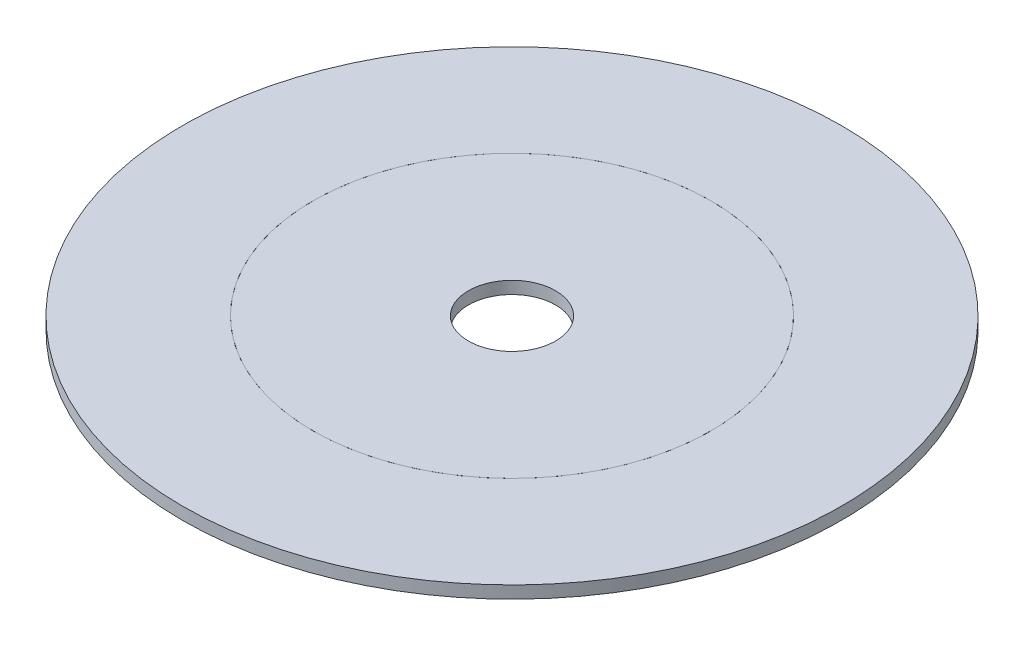
ISO-10303-21;
HEADER;
FILE_DESCRIPTION(('STEP AP214'),'2;1');
FILE_NAME('part.step','',(''),(''),'','','');
FILE_SCHEMA(('AUTOMOTIVE_DESIGN { 1 0 10303 214 1 1 1 1 }'));
ENDSEC;
DATA;
#1=APPLICATION_CONTEXT('core data for automotive mechanical design processes');
#2=APPLICATION_PROTOCOL_DEFINITION('international standard','automotive_design',2000,#1);
#3=PRODUCT_CONTEXT('',#1,'mechanical');
#4=PRODUCT('Part','Part','',(#3));
#5=PRODUCT_RELATED_PRODUCT_CATEGORY('part','',(#4));
#6=PRODUCT_DEFINITION_FORMATION('','',#4);
#7=PRODUCT_DEFINITION_CONTEXT('part definition',#1,'design');
#8=PRODUCT_DEFINITION('design','',#6,#7);
#9=PRODUCT_DEFINITION_SHAPE('','',#8);
#10=(LENGTH_UNIT() NAMED_UNIT(*) SI_UNIT(.MILLI.,.METRE.));
#11=(NAMED_UNIT(*) PLANE_ANGLE_UNIT() SI_UNIT($,.RADIAN.));
#12=(NAMED_UNIT(*) SI_UNIT($,.STERADIAN.) SOLID_ANGLE_UNIT());
#13=UNCERTAINTY_MEASURE_WITH_UNIT(LENGTH_MEASURE(1.E-05),#10,'distance_accuracy_value','');
#14=(GEOMETRIC_REPRESENTATION_CONTEXT(3) GLOBAL_UNCERTAINTY_ASSIGNED_CONTEXT((#13)) GLOBAL_UNIT_ASSIGNED_CONTEXT((#10,
#11,#12)) REPRESENTATION_CONTEXT('',''));
#15=CARTESIAN_POINT('',(0.,0.,0.));
#16=DIRECTION('',(0.,0.,1.));
#17=DIRECTION('',(1.,0.,0.));
#18=AXIS2_PLACEMENT_3D('',#15,#16,#17);
#19=CARTESIAN_POINT('',(0.,0.9,0.));
#20=DIRECTION('',(0.,-1.,0.));
#21=DIRECTION('',(0.,0.,-1.));
#22=AXIS2_PLACEMENT_3D('',#19,#20,#21);
#23=CYLINDRICAL_SURFACE('',#22,14.5);
#24=CARTESIAN_POINT('',(0.,0.9,0.));
#25=DIRECTION('',(0.,-1.,0.));
#26=DIRECTION('',(0.,0.,-1.));
#27=AXIS2_PLACEMENT_3D('',#24,#25,#26);
#28=CIRCLE('',#27,14.5);
#29=CARTESIAN_POINT('',(0.,0.9,-14.5));
#30=VERTEX_POINT('',#29);
#31=EDGE_CURVE('E11',#30,#30,#28,.T.);
#32=ORIENTED_EDGE('',*,*,#31,.T.);
#33=EDGE_LOOP('',(#32));
#34=FACE_BOUND('',#33,.T.);
#35=CARTESIAN_POINT('',(0.,0.,0.));
#36=DIRECTION('',(0.,-1.,0.));
#37=DIRECTION('',(0.,0.,-1.));
#38=AXIS2_PLACEMENT_3D('',#35,#36,#37);
#39=CIRCLE('',#38,14.5);
#40=CARTESIAN_POINT('',(0.,0.,-14.5));
#41=VERTEX_POINT('',#40);
#42=EDGE_CURVE('E43',#41,#41,#39,.T.);
#43=ORIENTED_EDGE('',*,*,#42,.F.);
#44=EDGE_LOOP('',(#43));
#45=FACE_BOUND('',#44,.T.);
#46=ADVANCED_FACE('F40',(#34,#45),#23,.T.);
#47=CARTESIAN_POINT('',(0.,0.9,0.));
#48=DIRECTION('',(0.,-1.,0.));
#49=DIRECTION('',(0.,0.,-1.));
#50=AXIS2_PLACEMENT_3D('',#47,#48,#49);
#51=PLANE('',#50);
#52=CARTESIAN_POINT('',(0.,0.9,0.));
#53=DIRECTION('',(0.,-1.,0.));
#54=DIRECTION('',(0.,0.,-1.));
#55=AXIS2_PLACEMENT_3D('',#52,#53,#54);
#56=CIRCLE('',#55,3.175);
#57=CARTESIAN_POINT('',(0.,0.9,-3.175));
#58=VERTEX_POINT('',#57);
#59=EDGE_CURVE('E50',#58,#58,#56,.T.);
#60=ORIENTED_EDGE('',*,*,#59,.T.);
#61=EDGE_LOOP('',(#60));
#62=FACE_BOUND('',#61,.T.);
#63=ORIENTED_EDGE('',*,*,#31,.F.);
#64=EDGE_LOOP('',(#63));
#65=FACE_BOUND('',#64,.T.);
#66=ADVANCED_FACE('F58',(#62,#65),#51,.F.);
#67=CARTESIAN_POINT('',(0.,0.,0.));
#68=DIRECTION('',(0.,-1.,0.));
#69=DIRECTION('',(0.,0.,-1.));
#70=AXIS2_PLACEMENT_3D('',#67,#68,#69);
#71=PLANE('',#70);
#72=CARTESIAN_POINT('',(0.,0.,0.));
#73=DIRECTION('',(0.,-1.,0.));
#74=DIRECTION('',(0.,0.,-1.));
#75=AXIS2_PLACEMENT_3D('',#72,#73,#74);
#76=CIRCLE('',#75,3.175);
#77=CARTESIAN_POINT('',(0.,0.,-3.175));
#78=VERTEX_POINT('',#77);
#79=EDGE_CURVE('E52',#78,#78,#76,.T.);
#80=ORIENTED_EDGE('',*,*,#79,.F.);
#81=EDGE_LOOP('',(#80));
#82=FACE_BOUND('',#81,.T.);
#83=ORIENTED_EDGE('',*,*,#42,.T.);
#84=EDGE_LOOP('',(#83));
#85=FACE_BOUND('',#84,.T.);
#86=ADVANCED_FACE('F64',(#82,#85),#71,.T.);
#87=CARTESIAN_POINT('',(0.,0.9,0.));
#88=DIRECTION('',(0.,-1.,0.));
#89=DIRECTION('',(0.,0.,-1.));
#90=AXIS2_PLACEMENT_3D('',#87,#88,#89);
#91=CYLINDRICAL_SURFACE('',#90,3.175);
#92=ORIENTED_EDGE('',*,*,#59,.F.);
#93=EDGE_LOOP('',(#92));
#94=FACE_BOUND('',#93,.T.);
#95=ORIENTED_EDGE('',*,*,#79,.T.);
#96=EDGE_LOOP('',(#95));
#97=FACE_BOUND('',#96,.T.);
#98=ADVANCED_FACE('F61',(#94,#97),#91,.F.);
#99=CLOSED_SHELL('',(#46,#66,#86,#98));
#100=MANIFOLD_SOLID_BREP('B2',#99);
#101=CARTESIAN_POINT('',(0.,0.9,0.));
#102=DIRECTION('',(0.,1.,0.));
#103=DIRECTION('',(0.,0.,1.));
#104=AXIS2_PLACEMENT_3D('',#101,#102,#103);
#105=PLANE('',#104);
#106=CARTESIAN_POINT('',(0.,0.9,0.));
#107=DIRECTION('',(0.,1.,0.));
#108=DIRECTION('',(0.,0.,1.));
#109=AXIS2_PLACEMENT_3D('',#106,#107,#108);
#110=CIRCLE('',#109,24.);
#111=CARTESIAN_POINT('',(0.,0.9,24.));
#112=VERTEX_POINT('',#111);
#113=EDGE_CURVE('E39',#112,#112,#110,.T.);
#114=ORIENTED_EDGE('',*,*,#113,.T.);
#115=EDGE_LOOP('',(#114));
#116=FACE_BOUND('',#115,.T.);
#117=CARTESIAN_POINT('',(0.,0.9,0.));
#118=DIRECTION('',(0.,1.,0.));
#119=DIRECTION('',(0.,0.,1.));
#120=AXIS2_PLACEMENT_3D('',#117,#118,#119);
#121=CIRCLE('',#120,14.5);
#122=CARTESIAN_POINT('',(0.,0.9,14.5));
#123=VERTEX_POINT('',#122);
#124=EDGE_CURVE('E112',#123,#123,#121,.T.);
#125=ORIENTED_EDGE('',*,*,#124,.F.);
#126=EDGE_LOOP('',(#125));
#127=FACE_BOUND('',#126,.T.);
#128=ADVANCED_FACE('F101',(#116,#127),#105,.T.);
#129=CARTESIAN_POINT('',(0.,0.,0.));
#130=DIRECTION('',(0.,1.,0.));
#131=DIRECTION('',(0.,0.,1.));
#132=AXIS2_PLACEMENT_3D('',#129,#130,#131);
#133=PLANE('',#132);
#134=CARTESIAN_POINT('',(0.,0.,0.));
#135=DIRECTION('',(0.,1.,0.));
#136=DIRECTION('',(0.,0.,1.));
#137=AXIS2_PLACEMENT_3D('',#134,#135,#136);
#138=CIRCLE('',#137,24.);
#139=CARTESIAN_POINT('',(0.,0.,24.));
#140=VERTEX_POINT('',#139);
#141=EDGE_CURVE('E105',#140,#140,#138,.T.);
#142=ORIENTED_EDGE('',*,*,#141,.F.);
#143=EDGE_LOOP('',(#142));
#144=FACE_BOUND('',#143,.T.);
#145=CARTESIAN_POINT('',(0.,0.,0.));
#146=DIRECTION('',(0.,1.,0.));
#147=DIRECTION('',(0.,0.,1.));
#148=AXIS2_PLACEMENT_3D('',#145,#146,#147);
#149=CIRCLE('',#148,14.5);
#150=CARTESIAN_POINT('',(0.,0.,14.5));
#151=VERTEX_POINT('',#150);
#152=EDGE_CURVE('E114',#151,#151,#149,.T.);
#153=ORIENTED_EDGE('',*,*,#152,.T.);
#154=EDGE_LOOP('',(#153));
#155=FACE_BOUND('',#154,.T.);
#156=ADVANCED_FACE('F124',(#144,#155),#133,.F.);
#157=CARTESIAN_POINT('',(0.,0.9,0.));
#158=DIRECTION('',(0.,-1.,0.));
#159=DIRECTION('',(0.,0.,-1.));
#160=AXIS2_PLACEMENT_3D('',#157,#158,#159);
#161=CYLINDRICAL_SURFACE('',#160,24.);
#162=ORIENTED_EDGE('',*,*,#113,.F.);
#163=EDGE_LOOP('',(#162));
#164=FACE_BOUND('',#163,.T.);
#165=ORIENTED_EDGE('',*,*,#141,.T.);
#166=EDGE_LOOP('',(#165));
#167=FACE_BOUND('',#166,.T.);
#168=ADVANCED_FACE('F103',(#164,#167),#161,.T.);
#169=CARTESIAN_POINT('',(0.,0.9,0.));
#170=DIRECTION('',(0.,-1.,0.));
#171=DIRECTION('',(0.,0.,-1.));
#172=AXIS2_PLACEMENT_3D('',#169,#170,#171);
#173=CYLINDRICAL_SURFACE('',#172,14.5);
#174=ORIENTED_EDGE('',*,*,#124,.T.);
#175=EDGE_LOOP('',(#174));
#176=FACE_BOUND('',#175,.T.);
#177=ORIENTED_EDGE('',*,*,#152,.F.);
#178=EDGE_LOOP('',(#177));
#179=FACE_BOUND('',#178,.T.);
#180=ADVANCED_FACE('F120',(#176,#179),#173,.F.);
#181=CLOSED_SHELL('',(#128,#156,#168,#180));
#182=MANIFOLD_SOLID_BREP('B6',#181);
#183=ADVANCED_BREP_SHAPE_REPRESENTATION('',(#18,#100,#182),#14);
#184=SHAPE_DEFINITION_REPRESENTATION(#9,#183);
ENDSEC;
END-ISO-10303-21;
